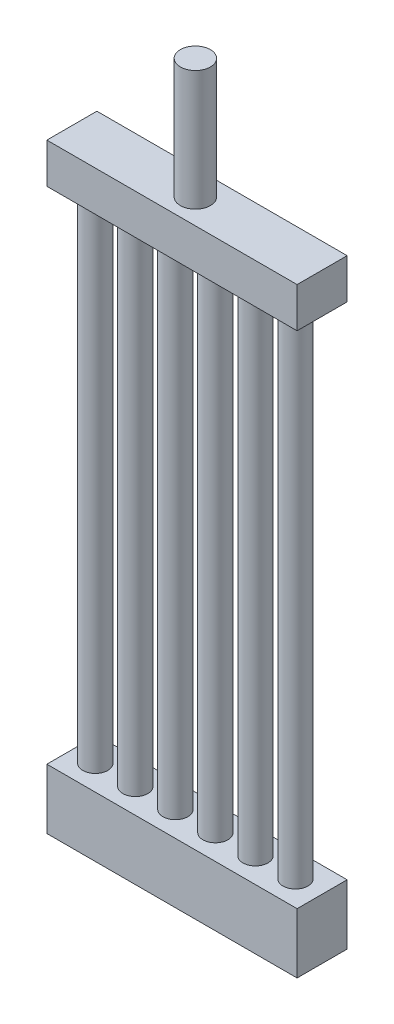
ISO-10303-21;
HEADER;
FILE_DESCRIPTION(('STEP AP214'),'2;1');
FILE_NAME('part.step','',(''),(''),'','','');
FILE_SCHEMA(('AUTOMOTIVE_DESIGN { 1 0 10303 214 1 1 1 1 }'));
ENDSEC;
DATA;
#1=APPLICATION_CONTEXT('core data for automotive mechanical design processes');
#2=APPLICATION_PROTOCOL_DEFINITION('international standard','automotive_design',2000,#1);
#3=PRODUCT_CONTEXT('',#1,'mechanical');
#4=PRODUCT('Part','Part','',(#3));
#5=PRODUCT_RELATED_PRODUCT_CATEGORY('part','',(#4));
#6=PRODUCT_DEFINITION_FORMATION('','',#4);
#7=PRODUCT_DEFINITION_CONTEXT('part definition',#1,'design');
#8=PRODUCT_DEFINITION('design','',#6,#7);
#9=PRODUCT_DEFINITION_SHAPE('','',#8);
#10=(LENGTH_UNIT() NAMED_UNIT(*) SI_UNIT(.MILLI.,.METRE.));
#11=(NAMED_UNIT(*) PLANE_ANGLE_UNIT() SI_UNIT($,.RADIAN.));
#12=(NAMED_UNIT(*) SI_UNIT($,.STERADIAN.) SOLID_ANGLE_UNIT());
#13=UNCERTAINTY_MEASURE_WITH_UNIT(LENGTH_MEASURE(1.E-05),#10,'distance_accuracy_value','');
#14=(GEOMETRIC_REPRESENTATION_CONTEXT(3) GLOBAL_UNCERTAINTY_ASSIGNED_CONTEXT((#13)) GLOBAL_UNIT_ASSIGNED_CONTEXT((#10,
#11,#12)) REPRESENTATION_CONTEXT('',''));
#15=CARTESIAN_POINT('',(0.,0.,0.));
#16=DIRECTION('',(0.,0.,1.));
#17=DIRECTION('',(1.,0.,0.));
#18=AXIS2_PLACEMENT_3D('',#15,#16,#17);
#19=CARTESIAN_POINT('',(66.34,262.,36.5));
#20=DIRECTION('',(0.,-1.,0.));
#21=DIRECTION('',(0.,0.,-1.));
#22=AXIS2_PLACEMENT_3D('',#19,#20,#21);
#23=CYLINDRICAL_SURFACE('',#22,1.5);
#24=CARTESIAN_POINT('',(66.34,262.,36.5));
#25=DIRECTION('',(0.,1.,0.));
#26=DIRECTION('',(0.,0.,1.));
#27=AXIS2_PLACEMENT_3D('',#24,#25,#26);
#28=CIRCLE('',#27,1.5);
#29=CARTESIAN_POINT('',(66.34,262.,38.));
#30=VERTEX_POINT('',#29);
#31=EDGE_CURVE('E11',#30,#30,#28,.T.);
#32=ORIENTED_EDGE('',*,*,#31,.F.);
#33=EDGE_LOOP('',(#32));
#34=FACE_BOUND('',#33,.T.);
#35=CARTESIAN_POINT('',(66.34,250.,36.5));
#36=DIRECTION('',(0.,1.,0.));
#37=DIRECTION('',(0.,0.,1.));
#38=AXIS2_PLACEMENT_3D('',#35,#36,#37);
#39=CIRCLE('',#38,1.5);
#40=CARTESIAN_POINT('',(66.34,250.,38.));
#41=VERTEX_POINT('',#40);
#42=EDGE_CURVE('E51',#41,#41,#39,.T.);
#43=ORIENTED_EDGE('',*,*,#42,.T.);
#44=EDGE_LOOP('',(#43));
#45=FACE_BOUND('',#44,.T.);
#46=ADVANCED_FACE('F48',(#34,#45),#23,.T.);
#47=CARTESIAN_POINT('',(66.34,262.,36.5));
#48=DIRECTION('',(0.,1.,0.));
#49=DIRECTION('',(0.,0.,1.));
#50=AXIS2_PLACEMENT_3D('',#47,#48,#49);
#51=PLANE('',#50);
#52=ORIENTED_EDGE('',*,*,#31,.T.);
#53=EDGE_LOOP('',(#52));
#54=FACE_BOUND('',#53,.T.);
#55=ADVANCED_FACE('F63',(#54),#51,.T.);
#56=CARTESIAN_POINT('',(66.34,250.,36.5));
#57=DIRECTION('',(0.,1.,0.));
#58=DIRECTION('',(0.,0.,1.));
#59=AXIS2_PLACEMENT_3D('',#56,#57,#58);
#60=PLANE('',#59);
#61=ORIENTED_EDGE('',*,*,#42,.F.);
#62=EDGE_LOOP('',(#61));
#63=FACE_BOUND('',#62,.T.);
#64=ADVANCED_FACE('F61',(#63),#60,.F.);
#65=CLOSED_SHELL('',(#46,#55,#64));
#66=MANIFOLD_SOLID_BREP('B2',#65);
#67=CARTESIAN_POINT('',(79.,246.,39.));
#68=DIRECTION('',(0.,0.,-1.));
#69=DIRECTION('',(-1.,0.,0.));
#70=AXIS2_PLACEMENT_3D('',#67,#68,#69);
#71=PLANE('',#70);
#72=DIRECTION('',(0.,-1.,0.));
#73=VECTOR('',#72,1.);
#74=CARTESIAN_POINT('',(54.,246.,39.));
#75=LINE('',#74,#73);
#76=CARTESIAN_POINT('',(54.,250.,39.));
#77=VERTEX_POINT('',#76);
#78=CARTESIAN_POINT('',(54.,246.,39.));
#79=VERTEX_POINT('',#78);
#80=EDGE_CURVE('E160',#77,#79,#75,.T.);
#81=ORIENTED_EDGE('',*,*,#80,.T.);
#82=DIRECTION('',(-1.,0.,0.));
#83=VECTOR('',#82,1.);
#84=CARTESIAN_POINT('',(79.,246.,39.));
#85=LINE('',#84,#83);
#86=CARTESIAN_POINT('',(79.,246.,39.));
#87=VERTEX_POINT('',#86);
#88=EDGE_CURVE('E46',#87,#79,#85,.T.);
#89=ORIENTED_EDGE('',*,*,#88,.F.);
#90=DIRECTION('',(0.,-1.,0.));
#91=VECTOR('',#90,1.);
#92=CARTESIAN_POINT('',(79.,246.,39.));
#93=LINE('',#92,#91);
#94=CARTESIAN_POINT('',(79.,250.,39.));
#95=VERTEX_POINT('',#94);
#96=EDGE_CURVE('E148',#95,#87,#93,.T.);
#97=ORIENTED_EDGE('',*,*,#96,.F.);
#98=DIRECTION('',(-1.,0.,0.));
#99=VECTOR('',#98,1.);
#100=CARTESIAN_POINT('',(79.,250.,39.));
#101=LINE('',#100,#99);
#102=EDGE_CURVE('E156',#95,#77,#101,.T.);
#103=ORIENTED_EDGE('',*,*,#102,.T.);
#104=EDGE_LOOP('',(#81,#89,#97,#103));
#105=FACE_BOUND('',#104,.T.);
#106=ADVANCED_FACE('F97',(#105),#71,.F.);
#107=CARTESIAN_POINT('',(79.,246.,34.));
#108=DIRECTION('',(0.,1.,0.));
#109=DIRECTION('',(0.,0.,1.));
#110=AXIS2_PLACEMENT_3D('',#107,#108,#109);
#111=PLANE('',#110);
#112=DIRECTION('',(0.,0.,-1.));
#113=VECTOR('',#112,1.);
#114=CARTESIAN_POINT('',(54.,246.,34.));
#115=LINE('',#114,#113);
#116=CARTESIAN_POINT('',(54.,246.,34.));
#117=VERTEX_POINT('',#116);
#118=EDGE_CURVE('E152',#79,#117,#115,.T.);
#119=ORIENTED_EDGE('',*,*,#118,.T.);
#120=DIRECTION('',(-1.,0.,0.));
#121=VECTOR('',#120,1.);
#122=CARTESIAN_POINT('',(79.,246.,34.));
#123=LINE('',#122,#121);
#124=CARTESIAN_POINT('',(79.,246.,34.));
#125=VERTEX_POINT('',#124);
#126=EDGE_CURVE('E105',#125,#117,#123,.T.);
#127=ORIENTED_EDGE('',*,*,#126,.F.);
#128=DIRECTION('',(0.,0.,-1.));
#129=VECTOR('',#128,1.);
#130=CARTESIAN_POINT('',(79.,246.,34.));
#131=LINE('',#130,#129);
#132=EDGE_CURVE('E143',#87,#125,#131,.T.);
#133=ORIENTED_EDGE('',*,*,#132,.F.);
#134=ORIENTED_EDGE('',*,*,#88,.T.);
#135=EDGE_LOOP('',(#119,#127,#133,#134));
#136=FACE_BOUND('',#135,.T.);
#137=ADVANCED_FACE('F151',(#136),#111,.F.);
#138=CARTESIAN_POINT('',(79.,246.,34.));
#139=DIRECTION('',(0.,0.,1.));
#140=DIRECTION('',(1.,0.,0.));
#141=AXIS2_PLACEMENT_3D('',#138,#139,#140);
#142=PLANE('',#141);
#143=DIRECTION('',(0.,1.,0.));
#144=VECTOR('',#143,1.);
#145=CARTESIAN_POINT('',(54.,246.,34.));
#146=LINE('',#145,#144);
#147=CARTESIAN_POINT('',(54.,250.,34.));
#148=VERTEX_POINT('',#147);
#149=EDGE_CURVE('E130',#117,#148,#146,.T.);
#150=ORIENTED_EDGE('',*,*,#149,.T.);
#151=DIRECTION('',(-1.,0.,0.));
#152=VECTOR('',#151,1.);
#153=CARTESIAN_POINT('',(79.,250.,34.));
#154=LINE('',#153,#152);
#155=CARTESIAN_POINT('',(79.,250.,34.));
#156=VERTEX_POINT('',#155);
#157=EDGE_CURVE('E153',#156,#148,#154,.T.);
#158=ORIENTED_EDGE('',*,*,#157,.F.);
#159=DIRECTION('',(0.,1.,0.));
#160=VECTOR('',#159,1.);
#161=CARTESIAN_POINT('',(79.,246.,34.));
#162=LINE('',#161,#160);
#163=EDGE_CURVE('E146',#125,#156,#162,.T.);
#164=ORIENTED_EDGE('',*,*,#163,.F.);
#165=ORIENTED_EDGE('',*,*,#126,.T.);
#166=EDGE_LOOP('',(#150,#158,#164,#165));
#167=FACE_BOUND('',#166,.T.);
#168=ADVANCED_FACE('F154',(#167),#142,.F.);
#169=CARTESIAN_POINT('',(79.,250.,34.));
#170=DIRECTION('',(0.,-1.,0.));
#171=DIRECTION('',(0.,0.,-1.));
#172=AXIS2_PLACEMENT_3D('',#169,#170,#171);
#173=PLANE('',#172);
#174=DIRECTION('',(0.,0.,1.));
#175=VECTOR('',#174,1.);
#176=CARTESIAN_POINT('',(54.,250.,34.));
#177=LINE('',#176,#175);
#178=EDGE_CURVE('E136',#148,#77,#177,.T.);
#179=ORIENTED_EDGE('',*,*,#178,.T.);
#180=ORIENTED_EDGE('',*,*,#102,.F.);
#181=DIRECTION('',(0.,0.,1.));
#182=VECTOR('',#181,1.);
#183=CARTESIAN_POINT('',(79.,250.,34.));
#184=LINE('',#183,#182);
#185=EDGE_CURVE('E113',#156,#95,#184,.T.);
#186=ORIENTED_EDGE('',*,*,#185,.F.);
#187=ORIENTED_EDGE('',*,*,#157,.T.);
#188=EDGE_LOOP('',(#179,#180,#186,#187));
#189=FACE_BOUND('',#188,.T.);
#190=ADVANCED_FACE('F167',(#189),#173,.F.);
#191=CARTESIAN_POINT('',(79.,0.,0.));
#192=DIRECTION('',(1.,0.,0.));
#193=DIRECTION('',(0.,0.,-1.));
#194=AXIS2_PLACEMENT_3D('',#191,#192,#193);
#195=PLANE('',#194);
#196=ORIENTED_EDGE('',*,*,#96,.T.);
#197=ORIENTED_EDGE('',*,*,#132,.T.);
#198=ORIENTED_EDGE('',*,*,#163,.T.);
#199=ORIENTED_EDGE('',*,*,#185,.T.);
#200=EDGE_LOOP('',(#196,#197,#198,#199));
#201=FACE_BOUND('',#200,.T.);
#202=ADVANCED_FACE('F144',(#201),#195,.T.);
#203=CARTESIAN_POINT('',(54.,0.,0.));
#204=DIRECTION('',(1.,0.,0.));
#205=DIRECTION('',(0.,0.,-1.));
#206=AXIS2_PLACEMENT_3D('',#203,#204,#205);
#207=PLANE('',#206);
#208=ORIENTED_EDGE('',*,*,#80,.F.);
#209=ORIENTED_EDGE('',*,*,#178,.F.);
#210=ORIENTED_EDGE('',*,*,#149,.F.);
#211=ORIENTED_EDGE('',*,*,#118,.F.);
#212=EDGE_LOOP('',(#208,#209,#210,#211));
#213=FACE_BOUND('',#212,.T.);
#214=ADVANCED_FACE('F170',(#213),#207,.F.);
#215=CLOSED_SHELL('',(#106,#137,#168,#190,#202,#214));
#216=MANIFOLD_SOLID_BREP('B6',#215);
#217=CARTESIAN_POINT('',(76.34,246.,36.5));
#218=DIRECTION('',(0.,-1.,0.));
#219=DIRECTION('',(0.,0.,-1.));
#220=AXIS2_PLACEMENT_3D('',#217,#218,#219);
#221=CYLINDRICAL_SURFACE('',#220,1.25);
#222=CARTESIAN_POINT('',(76.34,246.,36.5));
#223=DIRECTION('',(0.,1.,0.));
#224=DIRECTION('',(0.,0.,1.));
#225=AXIS2_PLACEMENT_3D('',#222,#223,#224);
#226=CIRCLE('',#225,1.25);
#227=CARTESIAN_POINT('',(76.34,246.,37.75));
#228=VERTEX_POINT('',#227);
#229=EDGE_CURVE('E96',#228,#228,#226,.T.);
#230=ORIENTED_EDGE('',*,*,#229,.F.);
#231=EDGE_LOOP('',(#230));
#232=FACE_BOUND('',#231,.T.);
#233=CARTESIAN_POINT('',(76.34,196.,36.5));
#234=DIRECTION('',(0.,1.,0.));
#235=DIRECTION('',(0.,0.,1.));
#236=AXIS2_PLACEMENT_3D('',#233,#234,#235);
#237=CIRCLE('',#236,1.25);
#238=CARTESIAN_POINT('',(76.34,196.,37.75));
#239=VERTEX_POINT('',#238);
#240=EDGE_CURVE('E232',#239,#239,#237,.T.);
#241=ORIENTED_EDGE('',*,*,#240,.T.);
#242=EDGE_LOOP('',(#241));
#243=FACE_BOUND('',#242,.T.);
#244=ADVANCED_FACE('F229',(#232,#243),#221,.T.);
#245=CARTESIAN_POINT('',(76.34,246.,36.5));
#246=DIRECTION('',(0.,1.,0.));
#247=DIRECTION('',(0.,0.,1.));
#248=AXIS2_PLACEMENT_3D('',#245,#246,#247);
#249=PLANE('',#248);
#250=ORIENTED_EDGE('',*,*,#229,.T.);
#251=EDGE_LOOP('',(#250));
#252=FACE_BOUND('',#251,.T.);
#253=ADVANCED_FACE('F244',(#252),#249,.T.);
#254=CARTESIAN_POINT('',(76.34,196.,36.5));
#255=DIRECTION('',(0.,1.,0.));
#256=DIRECTION('',(0.,0.,1.));
#257=AXIS2_PLACEMENT_3D('',#254,#255,#256);
#258=PLANE('',#257);
#259=ORIENTED_EDGE('',*,*,#240,.F.);
#260=EDGE_LOOP('',(#259));
#261=FACE_BOUND('',#260,.T.);
#262=ADVANCED_FACE('F242',(#261),#258,.F.);
#263=CLOSED_SHELL('',(#244,#253,#262));
#264=MANIFOLD_SOLID_BREP('B40',#263);
#265=CARTESIAN_POINT('',(72.34,246.,36.5));
#266=DIRECTION('',(0.,-1.,0.));
#267=DIRECTION('',(0.,0.,-1.));
#268=AXIS2_PLACEMENT_3D('',#265,#266,#267);
#269=CYLINDRICAL_SURFACE('',#268,1.25);
#270=CARTESIAN_POINT('',(72.34,246.,36.5));
#271=DIRECTION('',(0.,1.,0.));
#272=DIRECTION('',(0.,0.,1.));
#273=AXIS2_PLACEMENT_3D('',#270,#271,#272);
#274=CIRCLE('',#273,1.25);
#275=CARTESIAN_POINT('',(72.34,246.,37.75));
#276=VERTEX_POINT('',#275);
#277=EDGE_CURVE('E228',#276,#276,#274,.T.);
#278=ORIENTED_EDGE('',*,*,#277,.F.);
#279=EDGE_LOOP('',(#278));
#280=FACE_BOUND('',#279,.T.);
#281=CARTESIAN_POINT('',(72.34,196.,36.5));
#282=DIRECTION('',(0.,1.,0.));
#283=DIRECTION('',(0.,0.,1.));
#284=AXIS2_PLACEMENT_3D('',#281,#282,#283);
#285=CIRCLE('',#284,1.25);
#286=CARTESIAN_POINT('',(72.34,196.,37.75));
#287=VERTEX_POINT('',#286);
#288=EDGE_CURVE('E281',#287,#287,#285,.T.);
#289=ORIENTED_EDGE('',*,*,#288,.T.);
#290=EDGE_LOOP('',(#289));
#291=FACE_BOUND('',#290,.T.);
#292=ADVANCED_FACE('F278',(#280,#291),#269,.T.);
#293=CARTESIAN_POINT('',(72.34,246.,36.5));
#294=DIRECTION('',(0.,1.,0.));
#295=DIRECTION('',(0.,0.,1.));
#296=AXIS2_PLACEMENT_3D('',#293,#294,#295);
#297=PLANE('',#296);
#298=ORIENTED_EDGE('',*,*,#277,.T.);
#299=EDGE_LOOP('',(#298));
#300=FACE_BOUND('',#299,.T.);
#301=ADVANCED_FACE('F293',(#300),#297,.T.);
#302=CARTESIAN_POINT('',(72.34,196.,36.5));
#303=DIRECTION('',(0.,1.,0.));
#304=DIRECTION('',(0.,0.,1.));
#305=AXIS2_PLACEMENT_3D('',#302,#303,#304);
#306=PLANE('',#305);
#307=ORIENTED_EDGE('',*,*,#288,.F.);
#308=EDGE_LOOP('',(#307));
#309=FACE_BOUND('',#308,.T.);
#310=ADVANCED_FACE('F291',(#309),#306,.F.);
#311=CLOSED_SHELL('',(#292,#301,#310));
#312=MANIFOLD_SOLID_BREP('B91',#311);
#313=CARTESIAN_POINT('',(68.34,246.,36.5));
#314=DIRECTION('',(0.,-1.,0.));
#315=DIRECTION('',(0.,0.,-1.));
#316=AXIS2_PLACEMENT_3D('',#313,#314,#315);
#317=CYLINDRICAL_SURFACE('',#316,1.25);
#318=CARTESIAN_POINT('',(68.34,246.,36.5));
#319=DIRECTION('',(0.,1.,0.));
#320=DIRECTION('',(0.,0.,1.));
#321=AXIS2_PLACEMENT_3D('',#318,#319,#320);
#322=CIRCLE('',#321,1.25);
#323=CARTESIAN_POINT('',(68.34,246.,37.75));
#324=VERTEX_POINT('',#323);
#325=EDGE_CURVE('E277',#324,#324,#322,.T.);
#326=ORIENTED_EDGE('',*,*,#325,.F.);
#327=EDGE_LOOP('',(#326));
#328=FACE_BOUND('',#327,.T.);
#329=CARTESIAN_POINT('',(68.34,196.,36.5));
#330=DIRECTION('',(0.,1.,0.));
#331=DIRECTION('',(0.,0.,1.));
#332=AXIS2_PLACEMENT_3D('',#329,#330,#331);
#333=CIRCLE('',#332,1.25);
#334=CARTESIAN_POINT('',(68.34,196.,37.75));
#335=VERTEX_POINT('',#334);
#336=EDGE_CURVE('E330',#335,#335,#333,.T.);
#337=ORIENTED_EDGE('',*,*,#336,.T.);
#338=EDGE_LOOP('',(#337));
#339=FACE_BOUND('',#338,.T.);
#340=ADVANCED_FACE('F327',(#328,#339),#317,.T.);
#341=CARTESIAN_POINT('',(68.34,246.,36.5));
#342=DIRECTION('',(0.,1.,0.));
#343=DIRECTION('',(0.,0.,1.));
#344=AXIS2_PLACEMENT_3D('',#341,#342,#343);
#345=PLANE('',#344);
#346=ORIENTED_EDGE('',*,*,#325,.T.);
#347=EDGE_LOOP('',(#346));
#348=FACE_BOUND('',#347,.T.);
#349=ADVANCED_FACE('F342',(#348),#345,.T.);
#350=CARTESIAN_POINT('',(68.34,196.,36.5));
#351=DIRECTION('',(0.,1.,0.));
#352=DIRECTION('',(0.,0.,1.));
#353=AXIS2_PLACEMENT_3D('',#350,#351,#352);
#354=PLANE('',#353);
#355=ORIENTED_EDGE('',*,*,#336,.F.);
#356=EDGE_LOOP('',(#355));
#357=FACE_BOUND('',#356,.T.);
#358=ADVANCED_FACE('F340',(#357),#354,.F.);
#359=CLOSED_SHELL('',(#340,#349,#358));
#360=MANIFOLD_SOLID_BREP('B223',#359);
#361=CARTESIAN_POINT('',(64.34,246.,36.5));
#362=DIRECTION('',(0.,-1.,0.));
#363=DIRECTION('',(0.,0.,-1.));
#364=AXIS2_PLACEMENT_3D('',#361,#362,#363);
#365=CYLINDRICAL_SURFACE('',#364,1.25);
#366=CARTESIAN_POINT('',(64.34,246.,36.5));
#367=DIRECTION('',(0.,1.,0.));
#368=DIRECTION('',(0.,0.,1.));
#369=AXIS2_PLACEMENT_3D('',#366,#367,#368);
#370=CIRCLE('',#369,1.25);
#371=CARTESIAN_POINT('',(64.34,246.,37.75));
#372=VERTEX_POINT('',#371);
#373=EDGE_CURVE('E326',#372,#372,#370,.T.);
#374=ORIENTED_EDGE('',*,*,#373,.F.);
#375=EDGE_LOOP('',(#374));
#376=FACE_BOUND('',#375,.T.);
#377=CARTESIAN_POINT('',(64.34,196.,36.5));
#378=DIRECTION('',(0.,1.,0.));
#379=DIRECTION('',(0.,0.,1.));
#380=AXIS2_PLACEMENT_3D('',#377,#378,#379);
#381=CIRCLE('',#380,1.25);
#382=CARTESIAN_POINT('',(64.34,196.,37.75));
#383=VERTEX_POINT('',#382);
#384=EDGE_CURVE('E379',#383,#383,#381,.T.);
#385=ORIENTED_EDGE('',*,*,#384,.T.);
#386=EDGE_LOOP('',(#385));
#387=FACE_BOUND('',#386,.T.);
#388=ADVANCED_FACE('F376',(#376,#387),#365,.T.);
#389=CARTESIAN_POINT('',(64.34,246.,36.5));
#390=DIRECTION('',(0.,1.,0.));
#391=DIRECTION('',(0.,0.,1.));
#392=AXIS2_PLACEMENT_3D('',#389,#390,#391);
#393=PLANE('',#392);
#394=ORIENTED_EDGE('',*,*,#373,.T.);
#395=EDGE_LOOP('',(#394));
#396=FACE_BOUND('',#395,.T.);
#397=ADVANCED_FACE('F391',(#396),#393,.T.);
#398=CARTESIAN_POINT('',(64.34,196.,36.5));
#399=DIRECTION('',(0.,1.,0.));
#400=DIRECTION('',(0.,0.,1.));
#401=AXIS2_PLACEMENT_3D('',#398,#399,#400);
#402=PLANE('',#401);
#403=ORIENTED_EDGE('',*,*,#384,.F.);
#404=EDGE_LOOP('',(#403));
#405=FACE_BOUND('',#404,.T.);
#406=ADVANCED_FACE('F389',(#405),#402,.F.);
#407=CLOSED_SHELL('',(#388,#397,#406));
#408=MANIFOLD_SOLID_BREP('B272',#407);
#409=CARTESIAN_POINT('',(60.34,246.,36.5));
#410=DIRECTION('',(0.,-1.,0.));
#411=DIRECTION('',(0.,0.,-1.));
#412=AXIS2_PLACEMENT_3D('',#409,#410,#411);
#413=CYLINDRICAL_SURFACE('',#412,1.25);
#414=CARTESIAN_POINT('',(60.34,246.,36.5));
#415=DIRECTION('',(0.,1.,0.));
#416=DIRECTION('',(0.,0.,1.));
#417=AXIS2_PLACEMENT_3D('',#414,#415,#416);
#418=CIRCLE('',#417,1.25);
#419=CARTESIAN_POINT('',(60.34,246.,37.75));
#420=VERTEX_POINT('',#419);
#421=EDGE_CURVE('E375',#420,#420,#418,.T.);
#422=ORIENTED_EDGE('',*,*,#421,.F.);
#423=EDGE_LOOP('',(#422));
#424=FACE_BOUND('',#423,.T.);
#425=CARTESIAN_POINT('',(60.34,196.,36.5));
#426=DIRECTION('',(0.,1.,0.));
#427=DIRECTION('',(0.,0.,1.));
#428=AXIS2_PLACEMENT_3D('',#425,#426,#427);
#429=CIRCLE('',#428,1.25);
#430=CARTESIAN_POINT('',(60.34,196.,37.75));
#431=VERTEX_POINT('',#430);
#432=EDGE_CURVE('E428',#431,#431,#429,.T.);
#433=ORIENTED_EDGE('',*,*,#432,.T.);
#434=EDGE_LOOP('',(#433));
#435=FACE_BOUND('',#434,.T.);
#436=ADVANCED_FACE('F425',(#424,#435),#413,.T.);
#437=CARTESIAN_POINT('',(60.34,246.,36.5));
#438=DIRECTION('',(0.,1.,0.));
#439=DIRECTION('',(0.,0.,1.));
#440=AXIS2_PLACEMENT_3D('',#437,#438,#439);
#441=PLANE('',#440);
#442=ORIENTED_EDGE('',*,*,#421,.T.);
#443=EDGE_LOOP('',(#442));
#444=FACE_BOUND('',#443,.T.);
#445=ADVANCED_FACE('F440',(#444),#441,.T.);
#446=CARTESIAN_POINT('',(60.34,196.,36.5));
#447=DIRECTION('',(0.,1.,0.));
#448=DIRECTION('',(0.,0.,1.));
#449=AXIS2_PLACEMENT_3D('',#446,#447,#448);
#450=PLANE('',#449);
#451=ORIENTED_EDGE('',*,*,#432,.F.);
#452=EDGE_LOOP('',(#451));
#453=FACE_BOUND('',#452,.T.);
#454=ADVANCED_FACE('F438',(#453),#450,.F.);
#455=CLOSED_SHELL('',(#436,#445,#454));
#456=MANIFOLD_SOLID_BREP('B321',#455);
#457=CARTESIAN_POINT('',(56.34,246.,36.5));
#458=DIRECTION('',(0.,-1.,0.));
#459=DIRECTION('',(0.,0.,-1.));
#460=AXIS2_PLACEMENT_3D('',#457,#458,#459);
#461=CYLINDRICAL_SURFACE('',#460,1.25);
#462=CARTESIAN_POINT('',(56.34,246.,36.5));
#463=DIRECTION('',(0.,1.,0.));
#464=DIRECTION('',(0.,0.,1.));
#465=AXIS2_PLACEMENT_3D('',#462,#463,#464);
#466=CIRCLE('',#465,1.25);
#467=CARTESIAN_POINT('',(56.34,246.,37.75));
#468=VERTEX_POINT('',#467);
#469=EDGE_CURVE('E424',#468,#468,#466,.T.);
#470=ORIENTED_EDGE('',*,*,#469,.F.);
#471=EDGE_LOOP('',(#470));
#472=FACE_BOUND('',#471,.T.);
#473=CARTESIAN_POINT('',(56.34,196.,36.5));
#474=DIRECTION('',(0.,1.,0.));
#475=DIRECTION('',(0.,0.,1.));
#476=AXIS2_PLACEMENT_3D('',#473,#474,#475);
#477=CIRCLE('',#476,1.25);
#478=CARTESIAN_POINT('',(56.34,196.,37.75));
#479=VERTEX_POINT('',#478);
#480=EDGE_CURVE('E478',#479,#479,#477,.T.);
#481=ORIENTED_EDGE('',*,*,#480,.T.);
#482=EDGE_LOOP('',(#481));
#483=FACE_BOUND('',#482,.T.);
#484=ADVANCED_FACE('F475',(#472,#483),#461,.T.);
#485=CARTESIAN_POINT('',(56.34,246.,36.5));
#486=DIRECTION('',(0.,1.,0.));
#487=DIRECTION('',(0.,0.,1.));
#488=AXIS2_PLACEMENT_3D('',#485,#486,#487);
#489=PLANE('',#488);
#490=ORIENTED_EDGE('',*,*,#469,.T.);
#491=EDGE_LOOP('',(#490));
#492=FACE_BOUND('',#491,.T.);
#493=ADVANCED_FACE('F490',(#492),#489,.T.);
#494=CARTESIAN_POINT('',(56.34,196.,36.5));
#495=DIRECTION('',(0.,1.,0.));
#496=DIRECTION('',(0.,0.,1.));
#497=AXIS2_PLACEMENT_3D('',#494,#495,#496);
#498=PLANE('',#497);
#499=ORIENTED_EDGE('',*,*,#480,.F.);
#500=EDGE_LOOP('',(#499));
#501=FACE_BOUND('',#500,.T.);
#502=ADVANCED_FACE('F488',(#501),#498,.F.);
#503=CLOSED_SHELL('',(#484,#493,#502));
#504=MANIFOLD_SOLID_BREP('B370',#503);
#505=CARTESIAN_POINT('',(79.,190.,39.));
#506=DIRECTION('',(0.,0.,-1.));
#507=DIRECTION('',(-1.,0.,0.));
#508=AXIS2_PLACEMENT_3D('',#505,#506,#507);
#509=PLANE('',#508);
#510=DIRECTION('',(0.,-1.,0.));
#511=VECTOR('',#510,1.);
#512=CARTESIAN_POINT('',(54.,190.,39.));
#513=LINE('',#512,#511);
#514=CARTESIAN_POINT('',(54.,196.,39.));
#515=VERTEX_POINT('',#514);
#516=CARTESIAN_POINT('',(54.,190.,39.));
#517=VERTEX_POINT('',#516);
#518=EDGE_CURVE('E579',#515,#517,#513,.T.);
#519=ORIENTED_EDGE('',*,*,#518,.T.);
#520=DIRECTION('',(-1.,0.,0.));
#521=VECTOR('',#520,1.);
#522=CARTESIAN_POINT('',(79.,190.,39.));
#523=LINE('',#522,#521);
#524=CARTESIAN_POINT('',(79.,190.,39.));
#525=VERTEX_POINT('',#524);
#526=EDGE_CURVE('E473',#525,#517,#523,.T.);
#527=ORIENTED_EDGE('',*,*,#526,.F.);
#528=DIRECTION('',(0.,-1.,0.));
#529=VECTOR('',#528,1.);
#530=CARTESIAN_POINT('',(79.,190.,39.));
#531=LINE('',#530,#529);
#532=CARTESIAN_POINT('',(79.,196.,39.));
#533=VERTEX_POINT('',#532);
#534=EDGE_CURVE('E567',#533,#525,#531,.T.);
#535=ORIENTED_EDGE('',*,*,#534,.F.);
#536=DIRECTION('',(-1.,0.,0.));
#537=VECTOR('',#536,1.);
#538=CARTESIAN_POINT('',(79.,196.,39.));
#539=LINE('',#538,#537);
#540=EDGE_CURVE('E575',#533,#515,#539,.T.);
#541=ORIENTED_EDGE('',*,*,#540,.T.);
#542=EDGE_LOOP('',(#519,#527,#535,#541));
#543=FACE_BOUND('',#542,.T.);
#544=ADVANCED_FACE('F516',(#543),#509,.F.);
#545=CARTESIAN_POINT('',(79.,190.,34.));
#546=DIRECTION('',(0.,1.,0.));
#547=DIRECTION('',(0.,0.,1.));
#548=AXIS2_PLACEMENT_3D('',#545,#546,#547);
#549=PLANE('',#548);
#550=DIRECTION('',(0.,0.,-1.));
#551=VECTOR('',#550,1.);
#552=CARTESIAN_POINT('',(54.,190.,34.));
#553=LINE('',#552,#551);
#554=CARTESIAN_POINT('',(54.,190.,34.));
#555=VERTEX_POINT('',#554);
#556=EDGE_CURVE('E571',#517,#555,#553,.T.);
#557=ORIENTED_EDGE('',*,*,#556,.T.);
#558=DIRECTION('',(-1.,0.,0.));
#559=VECTOR('',#558,1.);
#560=CARTESIAN_POINT('',(79.,190.,34.));
#561=LINE('',#560,#559);
#562=CARTESIAN_POINT('',(79.,190.,34.));
#563=VERTEX_POINT('',#562);
#564=EDGE_CURVE('E524',#563,#555,#561,.T.);
#565=ORIENTED_EDGE('',*,*,#564,.F.);
#566=DIRECTION('',(0.,0.,-1.));
#567=VECTOR('',#566,1.);
#568=CARTESIAN_POINT('',(79.,190.,34.));
#569=LINE('',#568,#567);
#570=EDGE_CURVE('E562',#525,#563,#569,.T.);
#571=ORIENTED_EDGE('',*,*,#570,.F.);
#572=ORIENTED_EDGE('',*,*,#526,.T.);
#573=EDGE_LOOP('',(#557,#565,#571,#572));
#574=FACE_BOUND('',#573,.T.);
#575=ADVANCED_FACE('F570',(#574),#549,.F.);
#576=CARTESIAN_POINT('',(79.,190.,34.));
#577=DIRECTION('',(0.,0.,1.));
#578=DIRECTION('',(1.,0.,0.));
#579=AXIS2_PLACEMENT_3D('',#576,#577,#578);
#580=PLANE('',#579);
#581=DIRECTION('',(0.,1.,0.));
#582=VECTOR('',#581,1.);
#583=CARTESIAN_POINT('',(54.,190.,34.));
#584=LINE('',#583,#582);
#585=CARTESIAN_POINT('',(54.,196.,34.));
#586=VERTEX_POINT('',#585);
#587=EDGE_CURVE('E549',#555,#586,#584,.T.);
#588=ORIENTED_EDGE('',*,*,#587,.T.);
#589=DIRECTION('',(-1.,0.,0.));
#590=VECTOR('',#589,1.);
#591=CARTESIAN_POINT('',(79.,196.,34.));
#592=LINE('',#591,#590);
#593=CARTESIAN_POINT('',(79.,196.,34.));
#594=VERTEX_POINT('',#593);
#595=EDGE_CURVE('E572',#594,#586,#592,.T.);
#596=ORIENTED_EDGE('',*,*,#595,.F.);
#597=DIRECTION('',(0.,1.,0.));
#598=VECTOR('',#597,1.);
#599=CARTESIAN_POINT('',(79.,190.,34.));
#600=LINE('',#599,#598);
#601=EDGE_CURVE('E565',#563,#594,#600,.T.);
#602=ORIENTED_EDGE('',*,*,#601,.F.);
#603=ORIENTED_EDGE('',*,*,#564,.T.);
#604=EDGE_LOOP('',(#588,#596,#602,#603));
#605=FACE_BOUND('',#604,.T.);
#606=ADVANCED_FACE('F573',(#605),#580,.F.);
#607=CARTESIAN_POINT('',(79.,196.,34.));
#608=DIRECTION('',(0.,-1.,0.));
#609=DIRECTION('',(0.,0.,-1.));
#610=AXIS2_PLACEMENT_3D('',#607,#608,#609);
#611=PLANE('',#610);
#612=DIRECTION('',(0.,0.,1.));
#613=VECTOR('',#612,1.);
#614=CARTESIAN_POINT('',(54.,196.,34.));
#615=LINE('',#614,#613);
#616=EDGE_CURVE('E555',#586,#515,#615,.T.);
#617=ORIENTED_EDGE('',*,*,#616,.T.);
#618=ORIENTED_EDGE('',*,*,#540,.F.);
#619=DIRECTION('',(0.,0.,1.));
#620=VECTOR('',#619,1.);
#621=CARTESIAN_POINT('',(79.,196.,34.));
#622=LINE('',#621,#620);
#623=EDGE_CURVE('E532',#594,#533,#622,.T.);
#624=ORIENTED_EDGE('',*,*,#623,.F.);
#625=ORIENTED_EDGE('',*,*,#595,.T.);
#626=EDGE_LOOP('',(#617,#618,#624,#625));
#627=FACE_BOUND('',#626,.T.);
#628=ADVANCED_FACE('F586',(#627),#611,.F.);
#629=CARTESIAN_POINT('',(79.,0.,0.));
#630=DIRECTION('',(1.,0.,0.));
#631=DIRECTION('',(0.,0.,-1.));
#632=AXIS2_PLACEMENT_3D('',#629,#630,#631);
#633=PLANE('',#632);
#634=ORIENTED_EDGE('',*,*,#534,.T.);
#635=ORIENTED_EDGE('',*,*,#570,.T.);
#636=ORIENTED_EDGE('',*,*,#601,.T.);
#637=ORIENTED_EDGE('',*,*,#623,.T.);
#638=EDGE_LOOP('',(#634,#635,#636,#637));
#639=FACE_BOUND('',#638,.T.);
#640=ADVANCED_FACE('F563',(#639),#633,.T.);
#641=CARTESIAN_POINT('',(54.,0.,0.));
#642=DIRECTION('',(1.,0.,0.));
#643=DIRECTION('',(0.,0.,-1.));
#644=AXIS2_PLACEMENT_3D('',#641,#642,#643);
#645=PLANE('',#644);
#646=ORIENTED_EDGE('',*,*,#518,.F.);
#647=ORIENTED_EDGE('',*,*,#616,.F.);
#648=ORIENTED_EDGE('',*,*,#587,.F.);
#649=ORIENTED_EDGE('',*,*,#556,.F.);
#650=EDGE_LOOP('',(#646,#647,#648,#649));
#651=FACE_BOUND('',#650,.T.);
#652=ADVANCED_FACE('F589',(#651),#645,.F.);
#653=CLOSED_SHELL('',(#544,#575,#606,#628,#640,#652));
#654=MANIFOLD_SOLID_BREP('B419',#653);
#655=ADVANCED_BREP_SHAPE_REPRESENTATION('',(#18,#66,#216,#264,#312,#360,#408,#456,#504,#654),#14);
#656=SHAPE_DEFINITION_REPRESENTATION(#9,#655);
ENDSEC;
END-ISO-10303-21;
